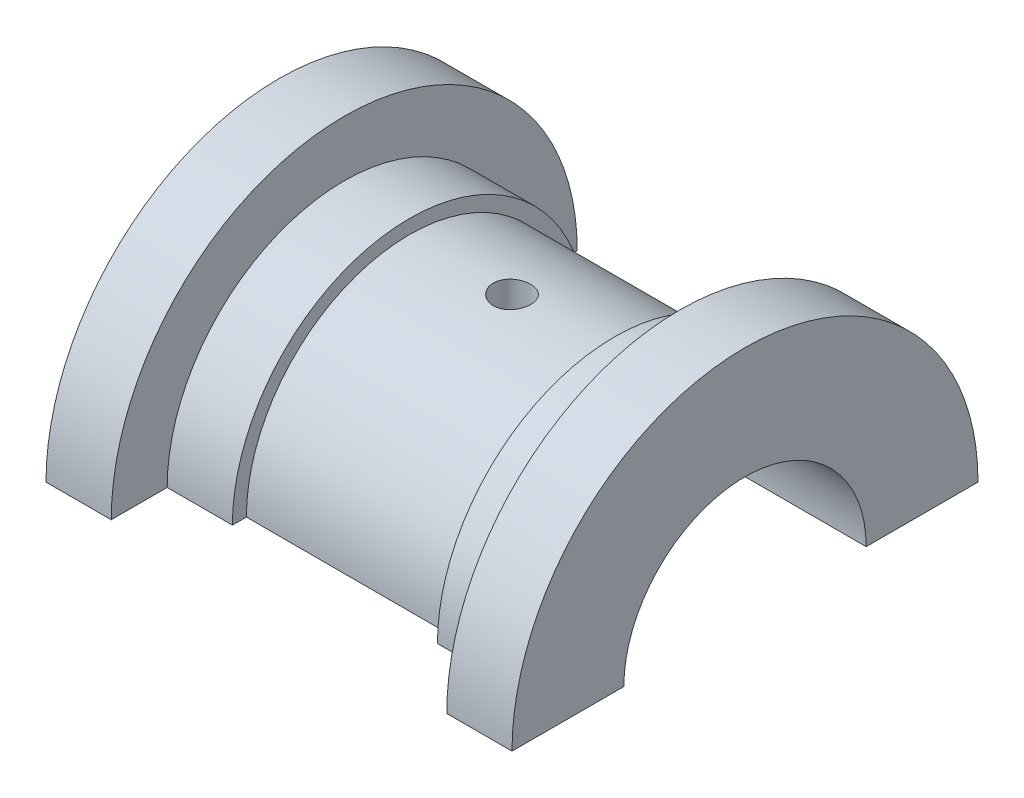
ISO-10303-21;
HEADER;
FILE_DESCRIPTION(('STEP AP214'),'2;1');
FILE_NAME('part.step','',(''),(''),'','','');
FILE_SCHEMA(('AUTOMOTIVE_DESIGN { 1 0 10303 214 1 1 1 1 }'));
ENDSEC;
DATA;
#1=APPLICATION_CONTEXT('core data for automotive mechanical design processes');
#2=APPLICATION_PROTOCOL_DEFINITION('international standard','automotive_design',2000,#1);
#3=PRODUCT_CONTEXT('',#1,'mechanical');
#4=PRODUCT('Part','Part','',(#3));
#5=PRODUCT_RELATED_PRODUCT_CATEGORY('part','',(#4));
#6=PRODUCT_DEFINITION_FORMATION('','',#4);
#7=PRODUCT_DEFINITION_CONTEXT('part definition',#1,'design');
#8=PRODUCT_DEFINITION('design','',#6,#7);
#9=PRODUCT_DEFINITION_SHAPE('','',#8);
#10=(LENGTH_UNIT() NAMED_UNIT(*) SI_UNIT(.MILLI.,.METRE.));
#11=(NAMED_UNIT(*) PLANE_ANGLE_UNIT() SI_UNIT($,.RADIAN.));
#12=(NAMED_UNIT(*) SI_UNIT($,.STERADIAN.) SOLID_ANGLE_UNIT());
#13=UNCERTAINTY_MEASURE_WITH_UNIT(LENGTH_MEASURE(1.E-05),#10,'distance_accuracy_value','');
#14=(GEOMETRIC_REPRESENTATION_CONTEXT(3) GLOBAL_UNCERTAINTY_ASSIGNED_CONTEXT((#13)) GLOBAL_UNIT_ASSIGNED_CONTEXT((#10,
#11,#12)) REPRESENTATION_CONTEXT('',''));
#15=CARTESIAN_POINT('',(0.,0.,0.));
#16=DIRECTION('',(0.,0.,1.));
#17=DIRECTION('',(1.,0.,0.));
#18=AXIS2_PLACEMENT_3D('',#15,#16,#17);
#19=CARTESIAN_POINT('',(43.,0.,0.));
#20=DIRECTION('',(1.,0.,0.));
#21=DIRECTION('',(0.,0.,-1.));
#22=AXIS2_PLACEMENT_3D('',#19,#20,#21);
#23=PLANE('',#22);
#24=CARTESIAN_POINT('',(43.,0.,0.));
#25=DIRECTION('',(-1.,0.,0.));
#26=DIRECTION('',(0.,0.,1.));
#27=AXIS2_PLACEMENT_3D('',#24,#25,#26);
#28=CIRCLE('',#27,19.);
#29=CARTESIAN_POINT('',(43.,0.,19.));
#30=VERTEX_POINT('',#29);
#31=CARTESIAN_POINT('',(43.,0.,-19.));
#32=VERTEX_POINT('',#31);
#33=EDGE_CURVE('E178',#30,#32,#28,.T.);
#34=ORIENTED_EDGE('',*,*,#33,.F.);
#35=DIRECTION('',(0.,0.,-1.));
#36=VECTOR('',#35,1.);
#37=CARTESIAN_POINT('',(43.,0.,25.));
#38=LINE('',#37,#36);
#39=CARTESIAN_POINT('',(43.,0.,25.));
#40=VERTEX_POINT('',#39);
#41=EDGE_CURVE('E199',#40,#30,#38,.T.);
#42=ORIENTED_EDGE('',*,*,#41,.F.);
#43=CARTESIAN_POINT('',(43.,0.,0.));
#44=DIRECTION('',(1.,0.,0.));
#45=DIRECTION('',(0.,0.,-1.));
#46=AXIS2_PLACEMENT_3D('',#43,#44,#45);
#47=CIRCLE('',#46,25.);
#48=CARTESIAN_POINT('',(43.,0.,-25.));
#49=VERTEX_POINT('',#48);
#50=EDGE_CURVE('E191',#49,#40,#47,.T.);
#51=ORIENTED_EDGE('',*,*,#50,.F.);
#52=DIRECTION('',(0.,0.,-1.));
#53=VECTOR('',#52,1.);
#54=CARTESIAN_POINT('',(43.,0.,-17.5));
#55=LINE('',#54,#53);
#56=EDGE_CURVE('E203',#32,#49,#55,.T.);
#57=ORIENTED_EDGE('',*,*,#56,.F.);
#58=EDGE_LOOP('',(#34,#42,#51,#57));
#59=FACE_BOUND('',#58,.T.);
#60=ADVANCED_FACE('F64',(#59),#23,.F.);
#61=CARTESIAN_POINT('',(57.,0.,0.));
#62=DIRECTION('',(-1.,0.,0.));
#63=DIRECTION('',(0.,0.,1.));
#64=AXIS2_PLACEMENT_3D('',#61,#62,#63);
#65=CYLINDRICAL_SURFACE('',#64,17.5);
#66=CARTESIAN_POINT('',(25.,17.3853386507137,2.));
#67=CARTESIAN_POINT('',(25.1119465893725,17.3853401353315,1.99999519733595));
#68=CARTESIAN_POINT('',(25.2239649949219,17.3864315751054,1.99056928251642));
#69=CARTESIAN_POINT('',(25.4448896716975,17.3906782331753,1.95311344773097));
#70=CARTESIAN_POINT('',(25.553792479504,17.3938356616542,1.92506360351944));
#71=CARTESIAN_POINT('',(25.7652550302795,17.4018520931882,1.85119296589626));
#72=CARTESIAN_POINT('',(25.8678188192856,17.4067099973959,1.80538364660709));
#73=CARTESIAN_POINT('',(26.0637820660459,17.4175786814491,1.6973178849601));
#74=CARTESIAN_POINT('',(26.1571832012678,17.423589249671,1.63506446086871));
#75=CARTESIAN_POINT('',(26.3326295637117,17.4361176819346,1.49556368835386));
#76=CARTESIAN_POINT('',(26.4146255279158,17.4426375676046,1.4182545582381));
#77=CARTESIAN_POINT('',(26.5645090224938,17.4554317583341,1.25096954824278));
#78=CARTESIAN_POINT('',(26.6323958771058,17.4617060516193,1.16099306200071));
#79=CARTESIAN_POINT('',(26.7523082405913,17.4733225280882,0.970620910263634));
#80=CARTESIAN_POINT('',(26.8042895580374,17.4786620969871,0.870197236204717));
#81=CARTESIAN_POINT('',(26.8906324060588,17.4877853680334,0.661974973209918));
#82=CARTESIAN_POINT('',(26.9249944880326,17.4915691188698,0.554176615186413));
#83=CARTESIAN_POINT('',(26.9749773425285,17.4971402074226,0.334766558288022));
#84=CARTESIAN_POINT('',(26.9906796485745,17.4989362281041,0.223173657194597));
#85=CARTESIAN_POINT('',(27.0031497214208,17.5003590938998,-0.00107691382556069));
#86=CARTESIAN_POINT('',(26.9999181176064,17.4999860111176,-0.113734548235031));
#87=CARTESIAN_POINT('',(26.9746778272773,17.497119767547,-0.336362487849681));
#88=CARTESIAN_POINT('',(26.9527568204161,17.4946365066491,-0.446342879003271));
#89=CARTESIAN_POINT('',(26.8908968295038,17.487840154992,-0.661053445479788));
#90=CARTESIAN_POINT('',(26.8509575512933,17.4835270343592,-0.765783535057303));
#91=CARTESIAN_POINT('',(26.7541001909759,17.4735386514763,-0.967294288035757));
#92=CARTESIAN_POINT('',(26.6971437760071,17.4678603196472,-1.06405636819045));
#93=CARTESIAN_POINT('',(26.5678967844434,17.4557776619181,-1.24668163917683));
#94=CARTESIAN_POINT('',(26.4956056198324,17.449373308183,-1.33254441186904));
#95=CARTESIAN_POINT('',(26.3372491944878,17.436513040988,-1.49144815236604));
#96=CARTESIAN_POINT('',(26.2511075821001,17.4300570420279,-1.56441304576845));
#97=CARTESIAN_POINT('',(26.0677588923309,17.4178574111694,-1.69485961446738));
#98=CARTESIAN_POINT('',(25.9705517897151,17.4121137808956,-1.75234125445402));
#99=CARTESIAN_POINT('',(25.7677679397435,17.4019890438088,-1.85019181534949));
#100=CARTESIAN_POINT('',(25.6621885359197,17.3976083716403,-1.89055527879404));
#101=CARTESIAN_POINT('',(25.4456894234669,17.3907142897617,-1.95295957446188));
#102=CARTESIAN_POINT('',(25.334769928945,17.3882008052541,-1.97500114064276));
#103=CARTESIAN_POINT('',(25.1114092760071,17.3853390699854,-2.00003653434785));
#104=CARTESIAN_POINT('',(24.998980234501,17.384978682311,-2.00313713351255));
#105=CARTESIAN_POINT('',(24.7752042740881,17.3864318824203,-1.99048370024868));
#106=CARTESIAN_POINT('',(24.6638573360172,17.3882454316329,-1.97473000234356));
#107=CARTESIAN_POINT('',(24.4457222895682,17.3938311078367,-1.92490480743124));
#108=CARTESIAN_POINT('',(24.3389223464428,17.3975977651037,-1.89088445720912));
#109=CARTESIAN_POINT('',(24.1325437911439,17.4066608217964,-1.8055441206904));
#110=CARTESIAN_POINT('',(24.0329653930102,17.4119572665405,-1.75422362188829));
#111=CARTESIAN_POINT('',(23.8433718799369,17.4235123453982,-1.63547501760195));
#112=CARTESIAN_POINT('',(23.7534010871438,17.4297751382952,-1.56797655870491));
#113=CARTESIAN_POINT('',(23.5860276917414,17.442543959092,-1.41888814821184));
#114=CARTESIAN_POINT('',(23.508625496724,17.4490499948718,-1.33729773979956));
#115=CARTESIAN_POINT('',(23.3682145168255,17.4616092377759,-1.16187651855541));
#116=CARTESIAN_POINT('',(23.3052756622984,17.4676601534551,-1.06798954470543));
#117=CARTESIAN_POINT('',(23.1960606208064,17.4785935486018,-0.870915351390362));
#118=CARTESIAN_POINT('',(23.1497841459813,17.4834760482544,-0.767728292632569));
#119=CARTESIAN_POINT('',(23.0753243387601,17.4915122431867,-0.555220730050707));
#120=CARTESIAN_POINT('',(23.0470997649381,17.4946698766728,-0.445914831710691));
#121=CARTESIAN_POINT('',(23.0094105804807,17.498916830849,-0.224077216219365));
#122=CARTESIAN_POINT('',(22.9999452694562,17.500006228758,-0.111545619660736));
#123=CARTESIAN_POINT('',(23.0000548974977,17.4999937520126,0.112864401253137));
#124=CARTESIAN_POINT('',(23.0095216795494,17.4989043247502,0.224742894695053));
#125=CARTESIAN_POINT('',(23.0469987286575,17.4946812487719,0.445308378800858));
#126=CARTESIAN_POINT('',(23.0750089965599,17.4915475999627,0.553995369319137));
#127=CARTESIAN_POINT('',(23.1487457147218,17.4835868311737,0.765084431079248));
#128=CARTESIAN_POINT('',(23.1944678834659,17.478760120486,0.867488014290729));
#129=CARTESIAN_POINT('',(23.3023192664791,17.4679493137143,1.06318537269561));
#130=CARTESIAN_POINT('',(23.3644485447572,17.4619652131149,1.15647911234695));
#131=CARTESIAN_POINT('',(23.503753511789,17.4494678477128,1.33186210611053));
#132=CARTESIAN_POINT('',(23.5810097818051,17.4429518630308,1.41388716420689));
#133=CARTESIAN_POINT('',(23.7482109831857,17.4301475365176,1.5638533009412));
#134=CARTESIAN_POINT('',(23.8381589318487,17.4238592492669,1.63179102096622));
#135=CARTESIAN_POINT('',(24.0285196236507,17.4122005213083,1.75183717616199));
#136=CARTESIAN_POINT('',(24.1289653993624,17.4068331273112,1.80389349456594));
#137=CARTESIAN_POINT('',(24.3371743373681,17.3976597913728,1.89032803888977));
#138=CARTESIAN_POINT('',(24.4449292561348,17.3938521233529,1.92472581745879));
#139=CARTESIAN_POINT('',(24.6277221268789,17.3891702575432,1.96647476380521));
#140=CARTESIAN_POINT('',(24.7015995451687,17.3877403947785,1.97902906202811));
#141=CARTESIAN_POINT('',(24.8503072739117,17.3858240977585,1.99579326119775));
#142=CARTESIAN_POINT('',(24.925137578703,17.3853376579002,2.00000321170178));
#143=CARTESIAN_POINT('',(25.,17.3853386507137,2.));
#144=B_SPLINE_CURVE_WITH_KNOTS('',3,(#66,#67,#68,#69,#70,#71,#72,#73,#74,#75,#76,#77,#78,#79,
#80,#81,#82,#83,#84,#85,#86,#87,#88,#89,#90,#91,#92,#93,#94,#95,#96,#97,#98,#99,#100,#101,#102,
#103,#104,#105,#106,#107,#108,#109,#110,#111,#112,#113,#114,#115,#116,#117,#118,#119,#120,#121,
#122,#123,#124,#125,#126,#127,#128,#129,#130,#131,#132,#133,#134,#135,#136,#137,#138,#139,#140,
#141,#142,#143),.UNSPECIFIED.,.T.,.F.,(4,2,2,2,2,2,2,2,2,2,2,2,2,2,2,2,2,2,2,2,2,2,2,2,2,2,2,2,
2,2,2,2,2,2,2,2,2,2,4),(0.,0.335566330669862,0.671492236482428,1.00720146648589,
1.34284912082551,1.67990430025881,2.01697561937899,2.35497511648653,2.69296403516427,
3.02947062308712,3.36596602520248,3.7008914215613,4.03582228598059,4.37151337926361,
4.70721734706226,5.04483970261995,5.38246282812581,5.72019351085556,6.05791066376697,
6.39372230997642,6.72952799811686,7.06439829362764,7.39927851032251,7.73564232927688,
8.07201705412563,8.40998545131678,8.74794800946724,9.08513567305448,9.42231074728435,
9.75756507912589,10.0928194262631,10.4279927825518,10.7631674464669,11.1001786972192,
11.4372702038874,11.7754563049136,12.113267132881,12.3376728727777,12.5620772799196),.UNSPECIFIED.);
#145=CARTESIAN_POINT('',(25.,17.3853386507137,2.));
#146=VERTEX_POINT('',#145);
#147=EDGE_CURVE('E351',#146,#146,#144,.T.);
#148=ORIENTED_EDGE('',*,*,#147,.F.);
#149=EDGE_LOOP('',(#148));
#150=FACE_BOUND('',#149,.T.);
#151=CARTESIAN_POINT('',(36.,0.,0.));
#152=DIRECTION('',(1.,0.,0.));
#153=DIRECTION('',(0.,0.,1.));
#154=AXIS2_PLACEMENT_3D('',#151,#152,#153);
#155=CIRCLE('',#154,17.5);
#156=CARTESIAN_POINT('',(36.,0.,-17.5));
#157=VERTEX_POINT('',#156);
#158=CARTESIAN_POINT('',(36.,0.,17.5));
#159=VERTEX_POINT('',#158);
#160=EDGE_CURVE('E168',#157,#159,#155,.T.);
#161=ORIENTED_EDGE('',*,*,#160,.F.);
#162=DIRECTION('',(-1.,0.,0.));
#163=VECTOR('',#162,1.);
#164=CARTESIAN_POINT('',(57.,0.,-17.5));
#165=LINE('',#164,#163);
#166=CARTESIAN_POINT('',(14.,0.,-17.5));
#167=VERTEX_POINT('',#166);
#168=EDGE_CURVE('E164',#157,#167,#165,.T.);
#169=ORIENTED_EDGE('',*,*,#168,.T.);
#170=CARTESIAN_POINT('',(14.,0.,0.));
#171=DIRECTION('',(-1.,0.,0.));
#172=DIRECTION('',(0.,0.,-1.));
#173=AXIS2_PLACEMENT_3D('',#170,#171,#172);
#174=CIRCLE('',#173,17.5);
#175=CARTESIAN_POINT('',(14.,0.,17.5));
#176=VERTEX_POINT('',#175);
#177=EDGE_CURVE('E222',#176,#167,#174,.T.);
#178=ORIENTED_EDGE('',*,*,#177,.F.);
#179=DIRECTION('',(-1.,0.,0.));
#180=VECTOR('',#179,1.);
#181=CARTESIAN_POINT('',(57.,0.,17.5));
#182=LINE('',#181,#180);
#183=EDGE_CURVE('E243',#159,#176,#182,.T.);
#184=ORIENTED_EDGE('',*,*,#183,.F.);
#185=EDGE_LOOP('',(#161,#169,#178,#184));
#186=FACE_BOUND('',#185,.T.);
#187=ADVANCED_FACE('F314',(#150,#186),#65,.T.);
#188=CARTESIAN_POINT('',(7.,0.,0.));
#189=DIRECTION('',(-1.,0.,0.));
#190=DIRECTION('',(0.,0.,1.));
#191=AXIS2_PLACEMENT_3D('',#188,#189,#190);
#192=PLANE('',#191);
#193=CARTESIAN_POINT('',(7.,0.,0.));
#194=DIRECTION('',(1.,0.,0.));
#195=DIRECTION('',(0.,0.,-1.));
#196=AXIS2_PLACEMENT_3D('',#193,#194,#195);
#197=CIRCLE('',#196,19.);
#198=CARTESIAN_POINT('',(7.,0.,-19.));
#199=VERTEX_POINT('',#198);
#200=CARTESIAN_POINT('',(7.,0.,19.));
#201=VERTEX_POINT('',#200);
#202=EDGE_CURVE('E86',#199,#201,#197,.T.);
#203=ORIENTED_EDGE('',*,*,#202,.F.);
#204=DIRECTION('',(0.,0.,-1.));
#205=VECTOR('',#204,1.);
#206=CARTESIAN_POINT('',(7.,0.,-17.5));
#207=LINE('',#206,#205);
#208=CARTESIAN_POINT('',(7.,0.,-25.));
#209=VERTEX_POINT('',#208);
#210=EDGE_CURVE('E238',#199,#209,#207,.T.);
#211=ORIENTED_EDGE('',*,*,#210,.T.);
#212=CARTESIAN_POINT('',(7.,0.,0.));
#213=DIRECTION('',(-1.,0.,0.));
#214=DIRECTION('',(0.,0.,1.));
#215=AXIS2_PLACEMENT_3D('',#212,#213,#214);
#216=CIRCLE('',#215,25.);
#217=CARTESIAN_POINT('',(7.,0.,25.));
#218=VERTEX_POINT('',#217);
#219=EDGE_CURVE('E246',#218,#209,#216,.T.);
#220=ORIENTED_EDGE('',*,*,#219,.F.);
#221=DIRECTION('',(0.,0.,-1.));
#222=VECTOR('',#221,1.);
#223=CARTESIAN_POINT('',(7.,0.,27.5));
#224=LINE('',#223,#222);
#225=EDGE_CURVE('E91',#218,#201,#224,.T.);
#226=ORIENTED_EDGE('',*,*,#225,.T.);
#227=EDGE_LOOP('',(#203,#211,#220,#226));
#228=FACE_BOUND('',#227,.T.);
#229=ADVANCED_FACE('F323',(#228),#192,.F.);
#230=CARTESIAN_POINT('',(50.,0.,0.));
#231=DIRECTION('',(1.,0.,0.));
#232=DIRECTION('',(0.,0.,-1.));
#233=AXIS2_PLACEMENT_3D('',#230,#231,#232);
#234=PLANE('',#233);
#235=DIRECTION('',(0.,0.,-1.));
#236=VECTOR('',#235,1.);
#237=CARTESIAN_POINT('',(50.,0.,-13.));
#238=LINE('',#237,#236);
#239=CARTESIAN_POINT('',(50.,0.,-13.));
#240=VERTEX_POINT('',#239);
#241=CARTESIAN_POINT('',(50.,0.,-25.));
#242=VERTEX_POINT('',#241);
#243=EDGE_CURVE('E260',#240,#242,#238,.T.);
#244=ORIENTED_EDGE('',*,*,#243,.T.);
#245=CARTESIAN_POINT('',(50.,0.,0.));
#246=DIRECTION('',(1.,0.,0.));
#247=DIRECTION('',(0.,0.,-1.));
#248=AXIS2_PLACEMENT_3D('',#245,#246,#247);
#249=CIRCLE('',#248,25.);
#250=CARTESIAN_POINT('',(50.,0.,25.));
#251=VERTEX_POINT('',#250);
#252=EDGE_CURVE('E184',#242,#251,#249,.T.);
#253=ORIENTED_EDGE('',*,*,#252,.T.);
#254=DIRECTION('',(0.,0.,-1.));
#255=VECTOR('',#254,1.);
#256=CARTESIAN_POINT('',(50.,0.,25.));
#257=LINE('',#256,#255);
#258=CARTESIAN_POINT('',(50.,0.,13.));
#259=VERTEX_POINT('',#258);
#260=EDGE_CURVE('E253',#251,#259,#257,.T.);
#261=ORIENTED_EDGE('',*,*,#260,.T.);
#262=CARTESIAN_POINT('',(50.,0.,0.));
#263=DIRECTION('',(-1.,0.,0.));
#264=DIRECTION('',(0.,0.,-1.));
#265=AXIS2_PLACEMENT_3D('',#262,#263,#264);
#266=CIRCLE('',#265,13.);
#267=EDGE_CURVE('E256',#259,#240,#266,.T.);
#268=ORIENTED_EDGE('',*,*,#267,.T.);
#269=EDGE_LOOP('',(#244,#253,#261,#268));
#270=FACE_BOUND('',#269,.T.);
#271=ADVANCED_FACE('F302',(#270),#234,.T.);
#272=CARTESIAN_POINT('',(50.,0.,0.));
#273=DIRECTION('',(-1.,0.,0.));
#274=DIRECTION('',(0.,0.,1.));
#275=AXIS2_PLACEMENT_3D('',#272,#273,#274);
#276=CYLINDRICAL_SURFACE('',#275,25.);
#277=DIRECTION('',(-1.,0.,0.));
#278=VECTOR('',#277,1.);
#279=CARTESIAN_POINT('',(50.,0.,25.));
#280=LINE('',#279,#278);
#281=CARTESIAN_POINT('',(0.,0.,25.));
#282=VERTEX_POINT('',#281);
#283=EDGE_CURVE('E12',#218,#282,#280,.T.);
#284=ORIENTED_EDGE('',*,*,#283,.F.);
#285=ORIENTED_EDGE('',*,*,#219,.T.);
#286=DIRECTION('',(-1.,0.,0.));
#287=VECTOR('',#286,1.);
#288=CARTESIAN_POINT('',(50.,0.,-25.));
#289=LINE('',#288,#287);
#290=CARTESIAN_POINT('',(0.,0.,-25.));
#291=VERTEX_POINT('',#290);
#292=EDGE_CURVE('E263',#209,#291,#289,.T.);
#293=ORIENTED_EDGE('',*,*,#292,.T.);
#294=CARTESIAN_POINT('',(0.,0.,0.));
#295=DIRECTION('',(1.,0.,0.));
#296=DIRECTION('',(0.,0.,-1.));
#297=AXIS2_PLACEMENT_3D('',#294,#295,#296);
#298=CIRCLE('',#297,25.);
#299=EDGE_CURVE('E252',#291,#282,#298,.T.);
#300=ORIENTED_EDGE('',*,*,#299,.T.);
#301=EDGE_LOOP('',(#284,#285,#293,#300));
#302=FACE_BOUND('',#301,.T.);
#303=ADVANCED_FACE('F66',(#302),#276,.T.);
#304=CARTESIAN_POINT('',(50.,0.,25.));
#305=DIRECTION('',(0.,1.,0.));
#306=DIRECTION('',(0.,0.,1.));
#307=AXIS2_PLACEMENT_3D('',#304,#305,#306);
#308=PLANE('',#307);
#309=DIRECTION('',(0.,0.,1.));
#310=VECTOR('',#309,1.);
#311=CARTESIAN_POINT('',(36.,0.,17.5));
#312=LINE('',#311,#310);
#313=CARTESIAN_POINT('',(36.,0.,19.));
#314=VERTEX_POINT('',#313);
#315=EDGE_CURVE('E174',#159,#314,#312,.T.);
#316=ORIENTED_EDGE('',*,*,#315,.F.);
#317=ORIENTED_EDGE('',*,*,#183,.T.);
#318=DIRECTION('',(0.,0.,-1.));
#319=VECTOR('',#318,1.);
#320=CARTESIAN_POINT('',(14.,0.,19.));
#321=LINE('',#320,#319);
#322=CARTESIAN_POINT('',(14.,0.,19.));
#323=VERTEX_POINT('',#322);
#324=EDGE_CURVE('E218',#323,#176,#321,.T.);
#325=ORIENTED_EDGE('',*,*,#324,.F.);
#326=DIRECTION('',(-1.,0.,0.));
#327=VECTOR('',#326,1.);
#328=CARTESIAN_POINT('',(14.,0.,19.));
#329=LINE('',#328,#327);
#330=EDGE_CURVE('E235',#323,#201,#329,.T.);
#331=ORIENTED_EDGE('',*,*,#330,.T.);
#332=ORIENTED_EDGE('',*,*,#225,.F.);
#333=ORIENTED_EDGE('',*,*,#283,.T.);
#334=DIRECTION('',(0.,0.,-1.));
#335=VECTOR('',#334,1.);
#336=CARTESIAN_POINT('',(0.,0.,25.));
#337=LINE('',#336,#335);
#338=CARTESIAN_POINT('',(0.,0.,13.));
#339=VERTEX_POINT('',#338);
#340=EDGE_CURVE('E267',#282,#339,#337,.T.);
#341=ORIENTED_EDGE('',*,*,#340,.T.);
#342=DIRECTION('',(-1.,0.,0.));
#343=VECTOR('',#342,1.);
#344=CARTESIAN_POINT('',(50.,0.,13.));
#345=LINE('',#344,#343);
#346=EDGE_CURVE('E79',#259,#339,#345,.T.);
#347=ORIENTED_EDGE('',*,*,#346,.F.);
#348=ORIENTED_EDGE('',*,*,#260,.F.);
#349=DIRECTION('',(1.,0.,0.));
#350=VECTOR('',#349,1.);
#351=CARTESIAN_POINT('',(43.,0.,25.));
#352=LINE('',#351,#350);
#353=EDGE_CURVE('E205',#40,#251,#352,.T.);
#354=ORIENTED_EDGE('',*,*,#353,.F.);
#355=ORIENTED_EDGE('',*,*,#41,.T.);
#356=DIRECTION('',(1.,0.,0.));
#357=VECTOR('',#356,1.);
#358=CARTESIAN_POINT('',(36.,0.,19.));
#359=LINE('',#358,#357);
#360=EDGE_CURVE('E185',#314,#30,#359,.T.);
#361=ORIENTED_EDGE('',*,*,#360,.F.);
#362=EDGE_LOOP('',(#316,#317,#325,#331,#332,#333,#341,#347,#348,#354,#355,#361));
#363=FACE_BOUND('',#362,.T.);
#364=ADVANCED_FACE('F303',(#363),#308,.F.);
#365=CARTESIAN_POINT('',(50.,0.,0.));
#366=DIRECTION('',(-1.,0.,0.));
#367=DIRECTION('',(0.,0.,1.));
#368=AXIS2_PLACEMENT_3D('',#365,#366,#367);
#369=CYLINDRICAL_SURFACE('',#368,13.);
#370=CARTESIAN_POINT('',(25.,12.8452325786651,2.));
#371=CARTESIAN_POINT('',(25.1116253162778,12.8452344810903,1.99999541550281));
#372=CARTESIAN_POINT('',(25.2233145798784,12.8467033675426,1.9906232298912));
#373=CARTESIAN_POINT('',(25.4435679380136,12.8524159214752,1.95339347168527));
#374=CARTESIAN_POINT('',(25.5521289158725,12.8566622626623,1.92551808666861));
#375=CARTESIAN_POINT('',(25.7629058336472,12.8674376514805,1.85213775006505));
#376=CARTESIAN_POINT('',(25.8651266664865,12.8739649123685,1.80664659466621));
#377=CARTESIAN_POINT('',(26.0604706517347,12.8885645643303,1.69935896258461));
#378=CARTESIAN_POINT('',(26.1535950034807,12.896636751295,1.63756463940025));
#379=CARTESIAN_POINT('',(26.3288999663165,12.9134926681997,1.49886954845252));
#380=CARTESIAN_POINT('',(26.4109929198094,12.922281296972,1.42185856625913));
#381=CARTESIAN_POINT('',(26.5611447532027,12.9395361634044,1.2551542564136));
#382=CARTESIAN_POINT('',(26.6292028484115,12.948002383017,1.16546022012182));
#383=CARTESIAN_POINT('',(26.7496777463658,12.9637099080407,0.975372850066992));
#384=CARTESIAN_POINT('',(26.8020136312891,12.9709447961843,0.874927656151335));
#385=CARTESIAN_POINT('',(26.8890390240537,12.9833201656374,0.666542517316995));
#386=CARTESIAN_POINT('',(26.9237295117459,12.98846076324,0.558602988937955));
#387=CARTESIAN_POINT('',(26.9742131035355,12.9960337802372,0.339196634271208));
#388=CARTESIAN_POINT('',(26.9901531138339,12.9984872421914,0.227764347964194));
#389=CARTESIAN_POINT('',(27.003139573395,13.0004817082543,0.00378157467292773));
#390=CARTESIAN_POINT('',(27.0001871248863,13.0000228822726,-0.108768846694281));
#391=CARTESIAN_POINT('',(26.9755881057417,12.9962612482755,-0.330790236752382));
#392=CARTESIAN_POINT('',(26.9540995945918,12.9929824869212,-0.44027918310502));
#393=CARTESIAN_POINT('',(26.8932867069432,12.983976175614,-0.654078458079961));
#394=CARTESIAN_POINT('',(26.8539618521707,12.9782485599963,-0.758388647752903));
#395=CARTESIAN_POINT('',(26.758431806819,12.9649468483415,-0.95934597999553));
#396=CARTESIAN_POINT('',(26.702160389923,12.9573655304009,-1.05596114275492));
#397=CARTESIAN_POINT('',(26.5743829476232,12.9412007667622,-1.23843720047884));
#398=CARTESIAN_POINT('',(26.5028758681619,12.9326172517469,-1.32429735072025));
#399=CARTESIAN_POINT('',(26.345777258751,12.915299962037,-1.48375832336463));
#400=CARTESIAN_POINT('',(26.2600476953434,12.9065655514674,-1.55722315390934));
#401=CARTESIAN_POINT('',(26.077405771106,12.8900173369198,-1.68874531361845));
#402=CARTESIAN_POINT('',(25.9804933344583,12.8822035391841,-1.7468025383133));
#403=CARTESIAN_POINT('',(25.7780913668277,12.8683813118034,-1.84588167483737));
#404=CARTESIAN_POINT('',(25.6725946218543,12.8623744209571,-1.88688907798485));
#405=CARTESIAN_POINT('',(25.4560979930999,12.8528729440273,-1.95056489324026));
#406=CARTESIAN_POINT('',(25.3450985190331,12.8493781711997,-1.9732346685352));
#407=CARTESIAN_POINT('',(25.1219587525196,12.8453322016998,-1.99940410399481));
#408=CARTESIAN_POINT('',(25.0098416157375,12.8447513686729,-2.00309678102913));
#409=CARTESIAN_POINT('',(24.7865899756881,12.8465203033818,-1.9917198484391));
#410=CARTESIAN_POINT('',(24.675455440408,12.8488699752861,-1.97665085234752));
#411=CARTESIAN_POINT('',(24.4579250340201,12.8562079116162,-1.92834222467661));
#412=CARTESIAN_POINT('',(24.351507189872,12.8611821405404,-1.89519921724072));
#413=CARTESIAN_POINT('',(24.145737036916,12.8731971006298,-1.81178406924013));
#414=CARTESIAN_POINT('',(24.0463850939574,12.8802379387008,-1.7615110425181));
#415=CARTESIAN_POINT('',(23.8567031161988,12.8956624004429,-1.64480099787562));
#416=CARTESIAN_POINT('',(23.7664506304318,12.9040562014683,-1.5782393125549));
#417=CARTESIAN_POINT('',(23.5983277022868,12.9212103652239,-1.43101421024059));
#418=CARTESIAN_POINT('',(23.5204579981855,12.9299707497711,-1.35034995303562));
#419=CARTESIAN_POINT('',(23.3786153013366,12.9469638790917,-1.17635828853489));
#420=CARTESIAN_POINT('',(23.3147704043563,12.9551913123015,-1.08292585827324));
#421=CARTESIAN_POINT('',(23.2036831603876,12.9701084079627,-0.886549812869704));
#422=CARTESIAN_POINT('',(23.1564403401728,12.9767981142437,-0.783606468932996));
#423=CARTESIAN_POINT('',(23.0801017930694,12.9878627763237,-0.571526395780061));
#424=CARTESIAN_POINT('',(23.0509366973907,12.9922465705557,-0.462415116634576));
#425=CARTESIAN_POINT('',(23.011357229899,12.9982426344727,-0.240771121293669));
#426=CARTESIAN_POINT('',(23.0009415524905,12.9998550971359,-0.128238643884646));
#427=CARTESIAN_POINT('',(22.999189717136,13.000124707314,0.0958123278279495));
#428=CARTESIAN_POINT('',(23.0076578089514,12.9988121755827,0.207329304309454));
#429=CARTESIAN_POINT('',(23.0430127063513,12.9934405813291,0.427333299995703));
#430=CARTESIAN_POINT('',(23.0698994438415,12.9893815289608,0.535820330400721));
#431=CARTESIAN_POINT('',(23.1412576886575,12.9789709459201,0.746626444901648));
#432=CARTESIAN_POINT('',(23.1857149507333,12.9726212727246,0.848950448398589));
#433=CARTESIAN_POINT('',(23.2909311985424,12.9583259209828,1.04471732676651));
#434=CARTESIAN_POINT('',(23.3516907685073,12.9503801852404,1.13815988318731));
#435=CARTESIAN_POINT('',(23.4884916645366,12.9336775890077,1.31450277940283));
#436=CARTESIAN_POINT('',(23.5646772707483,12.924913526128,1.39729052004704));
#437=CARTESIAN_POINT('',(23.7298640807247,12.9076145442476,1.54897720391159));
#438=CARTESIAN_POINT('',(23.8188682857429,12.8990796794663,1.61787288545449));
#439=CARTESIAN_POINT('',(24.007788338126,12.8831510468064,1.74018891459018));
#440=CARTESIAN_POINT('',(24.1077657965212,12.8757643501487,1.79351501318929));
#441=CARTESIAN_POINT('',(24.3153264832587,12.8630514342093,1.88253750041786));
#442=CARTESIAN_POINT('',(24.4229017525358,12.8577230954835,1.91825203381176));
#443=CARTESIAN_POINT('',(24.6091219546761,12.8509503481968,1.96300920311728));
#444=CARTESIAN_POINT('',(24.6866215042794,12.8488176746051,1.97685930159686));
#445=CARTESIAN_POINT('',(24.8427367982512,12.8459581295057,1.99535625053637));
#446=CARTESIAN_POINT('',(24.921352526948,12.8452312382799,2.00000323008375));
#447=CARTESIAN_POINT('',(25.,12.8452325786651,2.));
#448=B_SPLINE_CURVE_WITH_KNOTS('',3,(#370,#371,#372,#373,#374,#375,#376,#377,#378,#379,#380,
#381,#382,#383,#384,#385,#386,#387,#388,#389,#390,#391,#392,#393,#394,#395,#396,#397,#398,#399,
#400,#401,#402,#403,#404,#405,#406,#407,#408,#409,#410,#411,#412,#413,#414,#415,#416,#417,#418,
#419,#420,#421,#422,#423,#424,#425,#426,#427,#428,#429,#430,#431,#432,#433,#434,#435,#436,#437,
#438,#439,#440,#441,#442,#443,#444,#445,#446,#447),.UNSPECIFIED.,.T.,.F.,(4,2,2,2,2,2,2,2,2,2,2,
2,2,2,2,2,2,2,2,2,2,2,2,2,2,2,2,2,2,2,2,2,2,2,2,2,2,2,4),(0.,0.334588454354124,
0.669499474060701,1.00414872940281,1.33875380277124,1.67587766624672,2.01302037327517,
2.35186964899048,2.69070010631138,3.0268578302043,3.36299594207587,3.69629577894522,
4.02960455363529,4.36423316798135,4.6988849406518,5.03699821959486,5.37511379101899,
5.71351649860546,6.05189404761721,6.38682303494394,6.72174106991509,7.05488593061306,
7.38804802792879,7.72384447749069,8.05966094015464,8.39842762674499,8.73718465633022,
9.07463360926146,9.41205906339029,9.74600302211117,10.0799457462362,10.4136182808737,
10.7473027750516,11.0842657680092,11.4213077836735,11.7603496490855,12.0990414743329,
12.3347846411441,12.5705245012832),.UNSPECIFIED.);
#449=CARTESIAN_POINT('',(25.,12.8452325786651,2.));
#450=VERTEX_POINT('',#449);
#451=EDGE_CURVE('E68',#450,#450,#448,.T.);
#452=ORIENTED_EDGE('',*,*,#451,.T.);
#453=EDGE_LOOP('',(#452));
#454=FACE_BOUND('',#453,.T.);
#455=CARTESIAN_POINT('',(0.,0.,0.));
#456=DIRECTION('',(-1.,0.,0.));
#457=DIRECTION('',(0.,0.,-1.));
#458=AXIS2_PLACEMENT_3D('',#455,#456,#457);
#459=CIRCLE('',#458,13.);
#460=CARTESIAN_POINT('',(0.,0.,-13.));
#461=VERTEX_POINT('',#460);
#462=EDGE_CURVE('E270',#339,#461,#459,.T.);
#463=ORIENTED_EDGE('',*,*,#462,.T.);
#464=DIRECTION('',(-1.,0.,0.));
#465=VECTOR('',#464,1.);
#466=CARTESIAN_POINT('',(50.,0.,-13.));
#467=LINE('',#466,#465);
#468=EDGE_CURVE('E278',#240,#461,#467,.T.);
#469=ORIENTED_EDGE('',*,*,#468,.F.);
#470=ORIENTED_EDGE('',*,*,#267,.F.);
#471=ORIENTED_EDGE('',*,*,#346,.T.);
#472=EDGE_LOOP('',(#463,#469,#470,#471));
#473=FACE_BOUND('',#472,.T.);
#474=ADVANCED_FACE('F289',(#454,#473),#369,.F.);
#475=CARTESIAN_POINT('',(50.,0.,-13.));
#476=DIRECTION('',(0.,1.,0.));
#477=DIRECTION('',(0.,0.,1.));
#478=AXIS2_PLACEMENT_3D('',#475,#476,#477);
#479=PLANE('',#478);
#480=ORIENTED_EDGE('',*,*,#168,.F.);
#481=DIRECTION('',(0.,0.,1.));
#482=VECTOR('',#481,1.);
#483=CARTESIAN_POINT('',(36.,0.,-19.));
#484=LINE('',#483,#482);
#485=CARTESIAN_POINT('',(36.,0.,-19.));
#486=VERTEX_POINT('',#485);
#487=EDGE_CURVE('E157',#486,#157,#484,.T.);
#488=ORIENTED_EDGE('',*,*,#487,.F.);
#489=DIRECTION('',(1.,0.,0.));
#490=VECTOR('',#489,1.);
#491=CARTESIAN_POINT('',(36.,0.,-19.));
#492=LINE('',#491,#490);
#493=EDGE_CURVE('E161',#486,#32,#492,.T.);
#494=ORIENTED_EDGE('',*,*,#493,.T.);
#495=ORIENTED_EDGE('',*,*,#56,.T.);
#496=DIRECTION('',(1.,0.,0.));
#497=VECTOR('',#496,1.);
#498=CARTESIAN_POINT('',(43.,0.,-25.));
#499=LINE('',#498,#497);
#500=EDGE_CURVE('E207',#49,#242,#499,.T.);
#501=ORIENTED_EDGE('',*,*,#500,.T.);
#502=ORIENTED_EDGE('',*,*,#243,.F.);
#503=ORIENTED_EDGE('',*,*,#468,.T.);
#504=DIRECTION('',(0.,0.,-1.));
#505=VECTOR('',#504,1.);
#506=CARTESIAN_POINT('',(0.,0.,-13.));
#507=LINE('',#506,#505);
#508=EDGE_CURVE('E257',#461,#291,#507,.T.);
#509=ORIENTED_EDGE('',*,*,#508,.T.);
#510=ORIENTED_EDGE('',*,*,#292,.F.);
#511=ORIENTED_EDGE('',*,*,#210,.F.);
#512=DIRECTION('',(-1.,0.,0.));
#513=VECTOR('',#512,1.);
#514=CARTESIAN_POINT('',(14.,0.,-19.));
#515=LINE('',#514,#513);
#516=CARTESIAN_POINT('',(14.,0.,-19.));
#517=VERTEX_POINT('',#516);
#518=EDGE_CURVE('E229',#517,#199,#515,.T.);
#519=ORIENTED_EDGE('',*,*,#518,.F.);
#520=DIRECTION('',(0.,0.,-1.));
#521=VECTOR('',#520,1.);
#522=CARTESIAN_POINT('',(14.,0.,-17.5));
#523=LINE('',#522,#521);
#524=EDGE_CURVE('E226',#167,#517,#523,.T.);
#525=ORIENTED_EDGE('',*,*,#524,.F.);
#526=EDGE_LOOP('',(#480,#488,#494,#495,#501,#502,#503,#509,#510,#511,#519,#525));
#527=FACE_BOUND('',#526,.T.);
#528=ADVANCED_FACE('F159',(#527),#479,.F.);
#529=CARTESIAN_POINT('',(0.,0.,0.));
#530=DIRECTION('',(1.,0.,0.));
#531=DIRECTION('',(0.,0.,-1.));
#532=AXIS2_PLACEMENT_3D('',#529,#530,#531);
#533=PLANE('',#532);
#534=ORIENTED_EDGE('',*,*,#299,.F.);
#535=ORIENTED_EDGE('',*,*,#508,.F.);
#536=ORIENTED_EDGE('',*,*,#462,.F.);
#537=ORIENTED_EDGE('',*,*,#340,.F.);
#538=EDGE_LOOP('',(#534,#535,#536,#537));
#539=FACE_BOUND('',#538,.T.);
#540=ADVANCED_FACE('F296',(#539),#533,.F.);
#541=CARTESIAN_POINT('',(14.,0.,0.));
#542=DIRECTION('',(-1.,0.,0.));
#543=DIRECTION('',(0.,0.,1.));
#544=AXIS2_PLACEMENT_3D('',#541,#542,#543);
#545=CYLINDRICAL_SURFACE('',#544,19.);
#546=ORIENTED_EDGE('',*,*,#202,.T.);
#547=ORIENTED_EDGE('',*,*,#330,.F.);
#548=CARTESIAN_POINT('',(14.,0.,0.));
#549=DIRECTION('',(1.,0.,0.));
#550=DIRECTION('',(0.,0.,-1.));
#551=AXIS2_PLACEMENT_3D('',#548,#549,#550);
#552=CIRCLE('',#551,19.);
#553=EDGE_CURVE('E214',#517,#323,#552,.T.);
#554=ORIENTED_EDGE('',*,*,#553,.F.);
#555=ORIENTED_EDGE('',*,*,#518,.T.);
#556=EDGE_LOOP('',(#546,#547,#554,#555));
#557=FACE_BOUND('',#556,.T.);
#558=ADVANCED_FACE('F321',(#557),#545,.T.);
#559=CARTESIAN_POINT('',(14.,0.,0.));
#560=DIRECTION('',(1.,0.,0.));
#561=DIRECTION('',(0.,0.,-1.));
#562=AXIS2_PLACEMENT_3D('',#559,#560,#561);
#563=PLANE('',#562);
#564=ORIENTED_EDGE('',*,*,#553,.T.);
#565=ORIENTED_EDGE('',*,*,#324,.T.);
#566=ORIENTED_EDGE('',*,*,#177,.T.);
#567=ORIENTED_EDGE('',*,*,#524,.T.);
#568=EDGE_LOOP('',(#564,#565,#566,#567));
#569=FACE_BOUND('',#568,.T.);
#570=ADVANCED_FACE('F316',(#569),#563,.T.);
#571=CARTESIAN_POINT('',(43.,0.,0.));
#572=DIRECTION('',(1.,0.,0.));
#573=DIRECTION('',(0.,0.,-1.));
#574=AXIS2_PLACEMENT_3D('',#571,#572,#573);
#575=CYLINDRICAL_SURFACE('',#574,25.);
#576=ORIENTED_EDGE('',*,*,#252,.F.);
#577=ORIENTED_EDGE('',*,*,#500,.F.);
#578=ORIENTED_EDGE('',*,*,#50,.T.);
#579=ORIENTED_EDGE('',*,*,#353,.T.);
#580=EDGE_LOOP('',(#576,#577,#578,#579));
#581=FACE_BOUND('',#580,.T.);
#582=ADVANCED_FACE('F306',(#581),#575,.T.);
#583=CARTESIAN_POINT('',(36.,0.,0.));
#584=DIRECTION('',(1.,0.,0.));
#585=DIRECTION('',(0.,0.,-1.));
#586=AXIS2_PLACEMENT_3D('',#583,#584,#585);
#587=CYLINDRICAL_SURFACE('',#586,19.);
#588=ORIENTED_EDGE('',*,*,#33,.T.);
#589=ORIENTED_EDGE('',*,*,#493,.F.);
#590=CARTESIAN_POINT('',(36.,0.,0.));
#591=DIRECTION('',(-1.,0.,0.));
#592=DIRECTION('',(0.,0.,1.));
#593=AXIS2_PLACEMENT_3D('',#590,#591,#592);
#594=CIRCLE('',#593,19.);
#595=EDGE_CURVE('E169',#314,#486,#594,.T.);
#596=ORIENTED_EDGE('',*,*,#595,.F.);
#597=ORIENTED_EDGE('',*,*,#360,.T.);
#598=EDGE_LOOP('',(#588,#589,#596,#597));
#599=FACE_BOUND('',#598,.T.);
#600=ADVANCED_FACE('F180',(#599),#587,.T.);
#601=CARTESIAN_POINT('',(36.,0.,0.));
#602=DIRECTION('',(-1.,0.,0.));
#603=DIRECTION('',(0.,0.,1.));
#604=AXIS2_PLACEMENT_3D('',#601,#602,#603);
#605=PLANE('',#604);
#606=ORIENTED_EDGE('',*,*,#595,.T.);
#607=ORIENTED_EDGE('',*,*,#487,.T.);
#608=ORIENTED_EDGE('',*,*,#160,.T.);
#609=ORIENTED_EDGE('',*,*,#315,.T.);
#610=EDGE_LOOP('',(#606,#607,#608,#609));
#611=FACE_BOUND('',#610,.T.);
#612=ADVANCED_FACE('F172',(#611),#605,.T.);
#613=CARTESIAN_POINT('',(25.,0.,0.));
#614=DIRECTION('',(0.,1.,0.));
#615=DIRECTION('',(0.,0.,1.));
#616=AXIS2_PLACEMENT_3D('',#613,#614,#615);
#617=CYLINDRICAL_SURFACE('',#616,2.);
#618=ORIENTED_EDGE('',*,*,#147,.T.);
#619=EDGE_LOOP('',(#618));
#620=FACE_BOUND('',#619,.T.);
#621=ORIENTED_EDGE('',*,*,#451,.F.);
#622=EDGE_LOOP('',(#621));
#623=FACE_BOUND('',#622,.T.);
#624=ADVANCED_FACE('F357',(#620,#623),#617,.F.);
#625=CLOSED_SHELL('',(#60,#187,#229,#271,#303,#364,#474,#528,#540,#558,#570,#582,#600,#612,#624));
#626=MANIFOLD_SOLID_BREP('B2',#625);
#627=ADVANCED_BREP_SHAPE_REPRESENTATION('',(#18,#626),#14);
#628=SHAPE_DEFINITION_REPRESENTATION(#9,#627);
ENDSEC;
END-ISO-10303-21;
